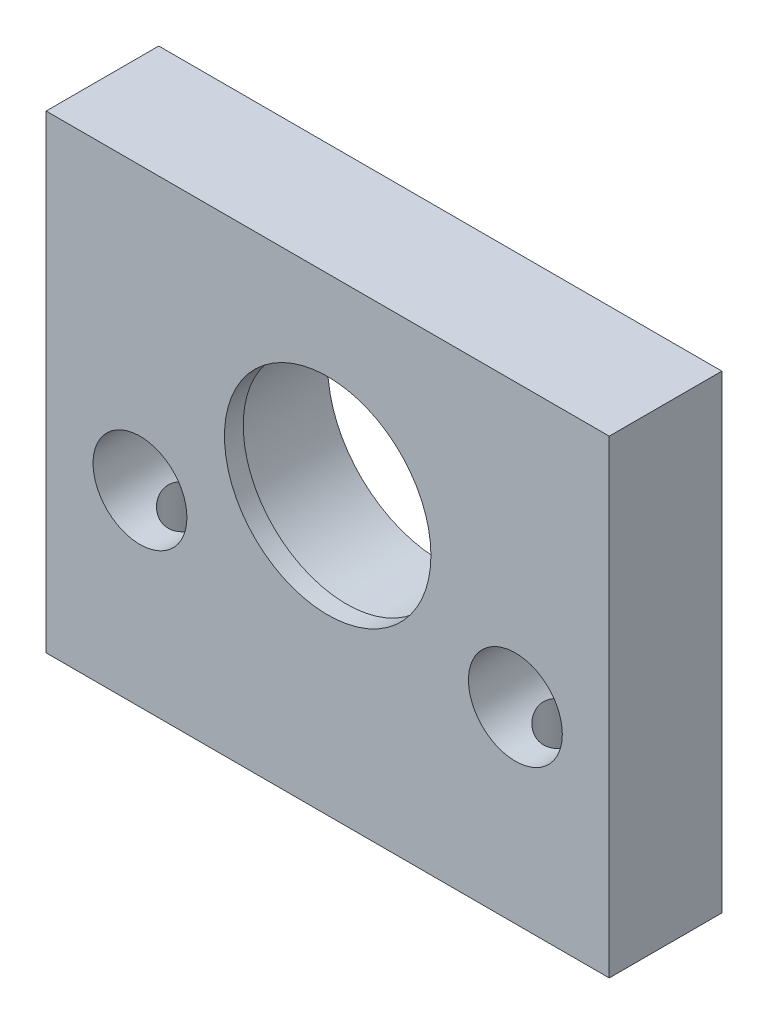
ISO-10303-21;
HEADER;
FILE_DESCRIPTION(('STEP AP214'),'2;1');
FILE_NAME('part.step','',(''),(''),'','','');
FILE_SCHEMA(('AUTOMOTIVE_DESIGN { 1 0 10303 214 1 1 1 1 }'));
ENDSEC;
DATA;
#1=APPLICATION_CONTEXT('core data for automotive mechanical design processes');
#2=APPLICATION_PROTOCOL_DEFINITION('international standard','automotive_design',2000,#1);
#3=PRODUCT_CONTEXT('',#1,'mechanical');
#4=PRODUCT('Part','Part','',(#3));
#5=PRODUCT_RELATED_PRODUCT_CATEGORY('part','',(#4));
#6=PRODUCT_DEFINITION_FORMATION('','',#4);
#7=PRODUCT_DEFINITION_CONTEXT('part definition',#1,'design');
#8=PRODUCT_DEFINITION('design','',#6,#7);
#9=PRODUCT_DEFINITION_SHAPE('','',#8);
#10=(LENGTH_UNIT() NAMED_UNIT(*) SI_UNIT(.MILLI.,.METRE.));
#11=(NAMED_UNIT(*) PLANE_ANGLE_UNIT() SI_UNIT($,.RADIAN.));
#12=(NAMED_UNIT(*) SI_UNIT($,.STERADIAN.) SOLID_ANGLE_UNIT());
#13=UNCERTAINTY_MEASURE_WITH_UNIT(LENGTH_MEASURE(1.E-05),#10,'distance_accuracy_value','');
#14=(GEOMETRIC_REPRESENTATION_CONTEXT(3) GLOBAL_UNCERTAINTY_ASSIGNED_CONTEXT((#13)) GLOBAL_UNIT_ASSIGNED_CONTEXT((#10,
#11,#12)) REPRESENTATION_CONTEXT('',''));
#15=CARTESIAN_POINT('',(0.,0.,0.));
#16=DIRECTION('',(0.,0.,1.));
#17=DIRECTION('',(1.,0.,0.));
#18=AXIS2_PLACEMENT_3D('',#15,#16,#17);
#19=CARTESIAN_POINT('',(30.,25.,12.));
#20=DIRECTION('',(-1.,0.,0.));
#21=DIRECTION('',(0.,-1.,0.));
#22=AXIS2_PLACEMENT_3D('',#19,#20,#21);
#23=PLANE('',#22);
#24=DIRECTION('',(0.,1.,0.));
#25=VECTOR('',#24,1.);
#26=CARTESIAN_POINT('',(30.,25.,0.));
#27=LINE('',#26,#25);
#28=CARTESIAN_POINT('',(30.,-25.,0.));
#29=VERTEX_POINT('',#28);
#30=CARTESIAN_POINT('',(30.,25.,0.));
#31=VERTEX_POINT('',#30);
#32=EDGE_CURVE('E96',#29,#31,#27,.T.);
#33=ORIENTED_EDGE('',*,*,#32,.T.);
#34=DIRECTION('',(0.,0.,-1.));
#35=VECTOR('',#34,1.);
#36=CARTESIAN_POINT('',(30.,25.,12.));
#37=LINE('',#36,#35);
#38=CARTESIAN_POINT('',(30.,25.,12.));
#39=VERTEX_POINT('',#38);
#40=EDGE_CURVE('E11',#39,#31,#37,.T.);
#41=ORIENTED_EDGE('',*,*,#40,.F.);
#42=DIRECTION('',(0.,1.,0.));
#43=VECTOR('',#42,1.);
#44=CARTESIAN_POINT('',(30.,25.,12.));
#45=LINE('',#44,#43);
#46=CARTESIAN_POINT('',(30.,-25.,12.));
#47=VERTEX_POINT('',#46);
#48=EDGE_CURVE('E84',#47,#39,#45,.T.);
#49=ORIENTED_EDGE('',*,*,#48,.F.);
#50=DIRECTION('',(0.,0.,-1.));
#51=VECTOR('',#50,1.);
#52=CARTESIAN_POINT('',(30.,-25.,12.));
#53=LINE('',#52,#51);
#54=EDGE_CURVE('E92',#47,#29,#53,.T.);
#55=ORIENTED_EDGE('',*,*,#54,.T.);
#56=EDGE_LOOP('',(#33,#41,#49,#55));
#57=FACE_BOUND('',#56,.T.);
#58=ADVANCED_FACE('F33',(#57),#23,.F.);
#59=CARTESIAN_POINT('',(-30.,25.,12.));
#60=DIRECTION('',(0.,-1.,0.));
#61=DIRECTION('',(0.,0.,-1.));
#62=AXIS2_PLACEMENT_3D('',#59,#60,#61);
#63=PLANE('',#62);
#64=DIRECTION('',(-1.,0.,0.));
#65=VECTOR('',#64,1.);
#66=CARTESIAN_POINT('',(-30.,25.,0.));
#67=LINE('',#66,#65);
#68=CARTESIAN_POINT('',(-30.,25.,0.));
#69=VERTEX_POINT('',#68);
#70=EDGE_CURVE('E88',#31,#69,#67,.T.);
#71=ORIENTED_EDGE('',*,*,#70,.T.);
#72=DIRECTION('',(0.,0.,-1.));
#73=VECTOR('',#72,1.);
#74=CARTESIAN_POINT('',(-30.,25.,12.));
#75=LINE('',#74,#73);
#76=CARTESIAN_POINT('',(-30.,25.,12.));
#77=VERTEX_POINT('',#76);
#78=EDGE_CURVE('E41',#77,#69,#75,.T.);
#79=ORIENTED_EDGE('',*,*,#78,.F.);
#80=DIRECTION('',(-1.,0.,0.));
#81=VECTOR('',#80,1.);
#82=CARTESIAN_POINT('',(-30.,25.,12.));
#83=LINE('',#82,#81);
#84=EDGE_CURVE('E79',#39,#77,#83,.T.);
#85=ORIENTED_EDGE('',*,*,#84,.F.);
#86=ORIENTED_EDGE('',*,*,#40,.T.);
#87=EDGE_LOOP('',(#71,#79,#85,#86));
#88=FACE_BOUND('',#87,.T.);
#89=ADVANCED_FACE('F87',(#88),#63,.F.);
#90=CARTESIAN_POINT('',(-30.,25.,12.));
#91=DIRECTION('',(1.,0.,0.));
#92=DIRECTION('',(0.,1.,0.));
#93=AXIS2_PLACEMENT_3D('',#90,#91,#92);
#94=PLANE('',#93);
#95=DIRECTION('',(0.,-1.,0.));
#96=VECTOR('',#95,1.);
#97=CARTESIAN_POINT('',(-30.,25.,0.));
#98=LINE('',#97,#96);
#99=CARTESIAN_POINT('',(-30.,-25.,0.));
#100=VERTEX_POINT('',#99);
#101=EDGE_CURVE('E66',#69,#100,#98,.T.);
#102=ORIENTED_EDGE('',*,*,#101,.T.);
#103=DIRECTION('',(0.,0.,-1.));
#104=VECTOR('',#103,1.);
#105=CARTESIAN_POINT('',(-30.,-25.,12.));
#106=LINE('',#105,#104);
#107=CARTESIAN_POINT('',(-30.,-25.,12.));
#108=VERTEX_POINT('',#107);
#109=EDGE_CURVE('E89',#108,#100,#106,.T.);
#110=ORIENTED_EDGE('',*,*,#109,.F.);
#111=DIRECTION('',(0.,-1.,0.));
#112=VECTOR('',#111,1.);
#113=CARTESIAN_POINT('',(-30.,25.,12.));
#114=LINE('',#113,#112);
#115=EDGE_CURVE('E82',#77,#108,#114,.T.);
#116=ORIENTED_EDGE('',*,*,#115,.F.);
#117=ORIENTED_EDGE('',*,*,#78,.T.);
#118=EDGE_LOOP('',(#102,#110,#116,#117));
#119=FACE_BOUND('',#118,.T.);
#120=ADVANCED_FACE('F90',(#119),#94,.F.);
#121=CARTESIAN_POINT('',(-30.,-25.,12.));
#122=DIRECTION('',(0.,1.,0.));
#123=DIRECTION('',(0.,0.,1.));
#124=AXIS2_PLACEMENT_3D('',#121,#122,#123);
#125=PLANE('',#124);
#126=CARTESIAN_POINT('',(-20.,-25.,6.));
#127=DIRECTION('',(0.,-1.,0.));
#128=DIRECTION('',(0.,0.,-1.));
#129=AXIS2_PLACEMENT_3D('',#126,#127,#128);
#130=CIRCLE('',#129,3.);
#131=CARTESIAN_POINT('',(-20.,-25.,2.99999999999999));
#132=VERTEX_POINT('',#131);
#133=EDGE_CURVE('E134',#132,#132,#130,.T.);
#134=ORIENTED_EDGE('',*,*,#133,.F.);
#135=EDGE_LOOP('',(#134));
#136=FACE_BOUND('',#135,.T.);
#137=CARTESIAN_POINT('',(20.,-25.,6.));
#138=DIRECTION('',(0.,-1.,0.));
#139=DIRECTION('',(0.,0.,-1.));
#140=AXIS2_PLACEMENT_3D('',#137,#138,#139);
#141=CIRCLE('',#140,2.99999999999999);
#142=CARTESIAN_POINT('',(20.,-25.,3.00000000000001));
#143=VERTEX_POINT('',#142);
#144=EDGE_CURVE('E124',#143,#143,#141,.T.);
#145=ORIENTED_EDGE('',*,*,#144,.F.);
#146=EDGE_LOOP('',(#145));
#147=FACE_BOUND('',#146,.T.);
#148=DIRECTION('',(1.,0.,0.));
#149=VECTOR('',#148,1.);
#150=CARTESIAN_POINT('',(-30.,-25.,0.));
#151=LINE('',#150,#149);
#152=EDGE_CURVE('E72',#100,#29,#151,.T.);
#153=ORIENTED_EDGE('',*,*,#152,.T.);
#154=ORIENTED_EDGE('',*,*,#54,.F.);
#155=DIRECTION('',(1.,0.,0.));
#156=VECTOR('',#155,1.);
#157=CARTESIAN_POINT('',(-30.,-25.,12.));
#158=LINE('',#157,#156);
#159=EDGE_CURVE('E49',#108,#47,#158,.T.);
#160=ORIENTED_EDGE('',*,*,#159,.F.);
#161=ORIENTED_EDGE('',*,*,#109,.T.);
#162=EDGE_LOOP('',(#153,#154,#160,#161));
#163=FACE_BOUND('',#162,.T.);
#164=ADVANCED_FACE('F104',(#136,#147,#163),#125,.F.);
#165=CARTESIAN_POINT('',(30.,-25.,12.));
#166=DIRECTION('',(0.,0.,1.));
#167=DIRECTION('',(1.,0.,0.));
#168=AXIS2_PLACEMENT_3D('',#165,#166,#167);
#169=PLANE('',#168);
#170=CARTESIAN_POINT('',(20.,-5.,12.));
#171=DIRECTION('',(0.,0.,1.));
#172=DIRECTION('',(1.,0.,0.));
#173=AXIS2_PLACEMENT_3D('',#170,#171,#172);
#174=CIRCLE('',#173,5.);
#175=CARTESIAN_POINT('',(25.,-5.,12.));
#176=VERTEX_POINT('',#175);
#177=EDGE_CURVE('E121',#176,#176,#174,.T.);
#178=ORIENTED_EDGE('',*,*,#177,.F.);
#179=EDGE_LOOP('',(#178));
#180=FACE_BOUND('',#179,.T.);
#181=CARTESIAN_POINT('',(-20.,-5.,12.));
#182=DIRECTION('',(0.,0.,1.));
#183=DIRECTION('',(1.,0.,0.));
#184=AXIS2_PLACEMENT_3D('',#181,#182,#183);
#185=CIRCLE('',#184,5.);
#186=CARTESIAN_POINT('',(-15.,-5.,12.));
#187=VERTEX_POINT('',#186);
#188=EDGE_CURVE('E115',#187,#187,#185,.T.);
#189=ORIENTED_EDGE('',*,*,#188,.F.);
#190=EDGE_LOOP('',(#189));
#191=FACE_BOUND('',#190,.T.);
#192=CARTESIAN_POINT('',(0.,4.5,12.));
#193=DIRECTION('',(0.,0.,1.));
#194=DIRECTION('',(1.,0.,0.));
#195=AXIS2_PLACEMENT_3D('',#192,#193,#194);
#196=CIRCLE('',#195,11.);
#197=CARTESIAN_POINT('',(11.,4.5,12.));
#198=VERTEX_POINT('',#197);
#199=EDGE_CURVE('E99',#198,#198,#196,.T.);
#200=ORIENTED_EDGE('',*,*,#199,.F.);
#201=EDGE_LOOP('',(#200));
#202=FACE_BOUND('',#201,.T.);
#203=ORIENTED_EDGE('',*,*,#48,.T.);
#204=ORIENTED_EDGE('',*,*,#84,.T.);
#205=ORIENTED_EDGE('',*,*,#115,.T.);
#206=ORIENTED_EDGE('',*,*,#159,.T.);
#207=EDGE_LOOP('',(#203,#204,#205,#206));
#208=FACE_BOUND('',#207,.T.);
#209=ADVANCED_FACE('F80',(#180,#191,#202,#208),#169,.T.);
#210=CARTESIAN_POINT('',(30.,-25.,0.));
#211=DIRECTION('',(0.,0.,1.));
#212=DIRECTION('',(1.,0.,0.));
#213=AXIS2_PLACEMENT_3D('',#210,#211,#212);
#214=PLANE('',#213);
#215=CARTESIAN_POINT('',(0.,4.5,0.));
#216=DIRECTION('',(0.,0.,1.));
#217=DIRECTION('',(1.,0.,0.));
#218=AXIS2_PLACEMENT_3D('',#215,#216,#217);
#219=CIRCLE('',#218,12.);
#220=CARTESIAN_POINT('',(12.,4.5,0.));
#221=VERTEX_POINT('',#220);
#222=EDGE_CURVE('E157',#221,#221,#219,.F.);
#223=ORIENTED_EDGE('',*,*,#222,.F.);
#224=EDGE_LOOP('',(#223));
#225=FACE_BOUND('',#224,.T.);
#226=CARTESIAN_POINT('',(20.,-5.,0.));
#227=DIRECTION('',(0.,0.,1.));
#228=DIRECTION('',(1.,0.,0.));
#229=AXIS2_PLACEMENT_3D('',#226,#227,#228);
#230=CIRCLE('',#229,5.);
#231=CARTESIAN_POINT('',(25.,-5.,0.));
#232=VERTEX_POINT('',#231);
#233=EDGE_CURVE('E118',#232,#232,#230,.F.);
#234=ORIENTED_EDGE('',*,*,#233,.F.);
#235=EDGE_LOOP('',(#234));
#236=FACE_BOUND('',#235,.T.);
#237=CARTESIAN_POINT('',(-20.,-5.,0.));
#238=DIRECTION('',(0.,0.,1.));
#239=DIRECTION('',(1.,0.,0.));
#240=AXIS2_PLACEMENT_3D('',#237,#238,#239);
#241=CIRCLE('',#240,5.);
#242=CARTESIAN_POINT('',(-15.,-5.,0.));
#243=VERTEX_POINT('',#242);
#244=EDGE_CURVE('E112',#243,#243,#241,.F.);
#245=ORIENTED_EDGE('',*,*,#244,.F.);
#246=EDGE_LOOP('',(#245));
#247=FACE_BOUND('',#246,.T.);
#248=ORIENTED_EDGE('',*,*,#32,.F.);
#249=ORIENTED_EDGE('',*,*,#152,.F.);
#250=ORIENTED_EDGE('',*,*,#101,.F.);
#251=ORIENTED_EDGE('',*,*,#70,.F.);
#252=EDGE_LOOP('',(#248,#249,#250,#251));
#253=FACE_BOUND('',#252,.T.);
#254=ADVANCED_FACE('F107',(#225,#236,#247,#253),#214,.F.);
#255=CARTESIAN_POINT('',(0.,4.5,10.));
#256=DIRECTION('',(0.,0.,1.));
#257=DIRECTION('',(1.,0.,0.));
#258=AXIS2_PLACEMENT_3D('',#255,#256,#257);
#259=CYLINDRICAL_SURFACE('',#258,11.);
#260=CARTESIAN_POINT('',(0.,4.5,10.));
#261=DIRECTION('',(0.,0.,1.));
#262=DIRECTION('',(1.,0.,0.));
#263=AXIS2_PLACEMENT_3D('',#260,#261,#262);
#264=CIRCLE('',#263,11.);
#265=CARTESIAN_POINT('',(11.,4.5,10.));
#266=VERTEX_POINT('',#265);
#267=EDGE_CURVE('E154',#266,#266,#264,.F.);
#268=ORIENTED_EDGE('',*,*,#267,.T.);
#269=EDGE_LOOP('',(#268));
#270=FACE_BOUND('',#269,.T.);
#271=ORIENTED_EDGE('',*,*,#199,.T.);
#272=EDGE_LOOP('',(#271));
#273=FACE_BOUND('',#272,.T.);
#274=ADVANCED_FACE('F172',(#270,#273),#259,.F.);
#275=CARTESIAN_POINT('',(-20.,-5.,-0.000999999999999265));
#276=DIRECTION('',(0.,0.,1.));
#277=DIRECTION('',(1.,0.,0.));
#278=AXIS2_PLACEMENT_3D('',#275,#276,#277);
#279=CYLINDRICAL_SURFACE('',#278,5.);
#280=CARTESIAN_POINT('',(-20.,-10.,2.99999999999999));
#281=CARTESIAN_POINT('',(-20.0767697294352,-9.99999907546385,3.00000105624453));
#282=CARTESIAN_POINT('',(-20.1535621345184,-9.99822567812271,3.00295359357007));
#283=CARTESIAN_POINT('',(-20.3065484877587,-9.99118362570631,3.01471423297973));
#284=CARTESIAN_POINT('',(-20.3827420593466,-9.98591292553957,3.02352576118822));
#285=CARTESIAN_POINT('',(-20.6098081300246,-9.96499345352549,3.05864855946312));
#286=CARTESIAN_POINT('',(-20.7589818632917,-9.94423772571335,3.09364770243343));
#287=CARTESIAN_POINT('',(-21.0475416736358,-9.89123238995897,3.18477274350412));
#288=CARTESIAN_POINT('',(-21.1869722674134,-9.85903979551111,3.24079392201273));
#289=CARTESIAN_POINT('',(-21.4540504280022,-9.7859070225578,3.37172066059704));
#290=CARTESIAN_POINT('',(-21.5817009093826,-9.74496901614699,3.44662153236015));
#291=CARTESIAN_POINT('',(-21.8326016038182,-9.65410731283371,3.61954965511511));
#292=CARTESIAN_POINT('',(-21.9547688598616,-9.60373587041895,3.71890739116653));
#293=CARTESIAN_POINT('',(-22.1817645874806,-9.50060875905921,3.93493440719218));
#294=CARTESIAN_POINT('',(-22.286570467504,-9.4478500955754,4.05162587421834));
#295=CARTESIAN_POINT('',(-22.4889001950984,-9.33822134833336,4.3158470211689));
#296=CARTESIAN_POINT('',(-22.5839553962784,-9.28164035635798,4.46540354212217));
#297=CARTESIAN_POINT('',(-22.7472286867078,-9.17876602596122,4.78169314632688));
#298=CARTESIAN_POINT('',(-22.8154903315581,-9.13245604474887,4.94839779203315));
#299=CARTESIAN_POINT('',(-22.9088120457722,-9.06709259377224,5.25319290165689));
#300=CARTESIAN_POINT('',(-22.9403239458764,-9.04415766338646,5.38847199836138));
#301=CARTESIAN_POINT('',(-22.9843234458708,-9.01180616527622,5.66360743052139));
#302=CARTESIAN_POINT('',(-22.9968346988436,-9.00237279089369,5.80345785330403));
#303=CARTESIAN_POINT('',(-23.0021101681982,-8.99841845126252,6.08402299264786));
#304=CARTESIAN_POINT('',(-22.9948356363078,-9.0039267475674,6.22473886591187));
#305=CARTESIAN_POINT('',(-22.960921241461,-9.02906522155629,6.50255753511785));
#306=CARTESIAN_POINT('',(-22.9342668122544,-9.04870602134774,6.63965753294148));
#307=CARTESIAN_POINT('',(-22.8634783193319,-9.09906376582929,6.90506054225053));
#308=CARTESIAN_POINT('',(-22.8195745342289,-9.12963433300038,7.03345432299445));
#309=CARTESIAN_POINT('',(-22.7159016746707,-9.19854092703027,7.2813897666318));
#310=CARTESIAN_POINT('',(-22.6561267841416,-9.2368797994146,7.40092816382902));
#311=CARTESIAN_POINT('',(-22.5103577382067,-9.32510698365562,7.64996913765634));
#312=CARTESIAN_POINT('',(-22.4216067190187,-9.3758426358075,7.77755999236773));
#313=CARTESIAN_POINT('',(-22.2258296320778,-9.47861022524151,8.01734915722011));
#314=CARTESIAN_POINT('',(-22.118786093355,-9.53064336077654,8.12953256540213));
#315=CARTESIAN_POINT('',(-21.8715904092136,-9.63871766962914,8.35124225944849));
#316=CARTESIAN_POINT('',(-21.7289031517877,-9.69430681953073,8.45821939123735));
#317=CARTESIAN_POINT('',(-21.5006105363028,-9.77018325995048,8.59926871272286));
#318=CARTESIAN_POINT('',(-21.4220982181568,-9.79423315237468,8.6430641355161));
#319=CARTESIAN_POINT('',(-21.2607436867391,-9.8391649675643,8.723718823611));
#320=CARTESIAN_POINT('',(-21.1779041750117,-9.86004883588963,8.7605823520208));
#321=CARTESIAN_POINT('',(-21.01376371174,-9.89682672744931,8.82481144285663));
#322=CARTESIAN_POINT('',(-20.9326900666639,-9.91295100454954,8.85262656044921));
#323=CARTESIAN_POINT('',(-20.7678799497328,-9.94139126794745,8.90133395584523));
#324=CARTESIAN_POINT('',(-20.6841449971746,-9.95370938553284,8.92223010844636));
#325=CARTESIAN_POINT('',(-20.5147444626544,-9.97416370514887,8.95677185472475));
#326=CARTESIAN_POINT('',(-20.4290803419696,-9.98230296820872,8.97042275582861));
#327=CARTESIAN_POINT('',(-20.2566217465922,-9.99415996414414,8.9902661843902));
#328=CARTESIAN_POINT('',(-20.1698274326177,-9.99787831889699,8.99645976085132));
#329=CARTESIAN_POINT('',(-19.9326757428893,-10.001791579548,9.00299267028362));
#330=CARTESIAN_POINT('',(-19.7819431573893,-9.99746512571837,8.9958115456306));
#331=CARTESIAN_POINT('',(-19.484313092371,-9.97557955020067,8.9591544582709));
#332=CARTESIAN_POINT('',(-19.337415535147,-9.95802069684413,8.92967894765814));
#333=CARTESIAN_POINT('',(-19.0548574007452,-9.91189447655688,8.85091154081572));
#334=CARTESIAN_POINT('',(-18.9190104514305,-9.88360514429733,8.80211887340799));
#335=CARTESIAN_POINT('',(-18.6574665481525,-9.81827798628348,8.68664567579909));
#336=CARTESIAN_POINT('',(-18.5317716025372,-9.78123843515362,8.61996161740592));
#337=CARTESIAN_POINT('',(-18.2799880786985,-9.69690981059277,8.46288590902202));
#338=CARTESIAN_POINT('',(-18.1552118617578,-9.6489560240695,8.37075230616252));
#339=CARTESIAN_POINT('',(-17.9219477745178,-9.54948534225871,8.16921724874524));
#340=CARTESIAN_POINT('',(-17.8134791484584,-9.49796434043363,8.05979570039729));
#341=CARTESIAN_POINT('',(-17.6013601173584,-9.38890846835682,7.81017920850684));
#342=CARTESIAN_POINT('',(-17.5001796211583,-9.33146483230154,7.66783222605696));
#343=CARTESIAN_POINT('',(-17.3230952079246,-9.2243236439557,7.36556795387244));
#344=CARTESIAN_POINT('',(-17.2471646615454,-9.17461796061409,7.20566941284874));
#345=CARTESIAN_POINT('',(-17.1371484264829,-9.09969818429266,6.90751395488927));
#346=CARTESIAN_POINT('',(-17.0975674933739,-9.07151318633887,6.77203937535795));
#347=CARTESIAN_POINT('',(-17.037726721783,-9.02819211510624,6.49493584376476));
#348=CARTESIAN_POINT('',(-17.0174400960493,-9.01303795327895,6.35331571054848));
#349=CARTESIAN_POINT('',(-16.9973173896579,-8.99800893189922,6.06724610560478));
#350=CARTESIAN_POINT('',(-16.9975582096915,-8.99819152744816,5.92278802175169));
#351=CARTESIAN_POINT('',(-17.0186705489689,-9.01395435932838,5.6362111256536));
#352=CARTESIAN_POINT('',(-17.0395532863041,-9.02954296823692,5.49409362812519));
#353=CARTESIAN_POINT('',(-17.0991964878777,-9.07266369966216,5.2230231760049));
#354=CARTESIAN_POINT('',(-17.1370471567135,-9.09958421715569,5.09376585207564));
#355=CARTESIAN_POINT('',(-17.2287352648797,-9.16211005816609,4.84332545034685));
#356=CARTESIAN_POINT('',(-17.2825787248228,-9.19771865147484,4.722145434387));
#357=CARTESIAN_POINT('',(-17.414214631403,-9.28025972950371,4.47136046054001));
#358=CARTESIAN_POINT('',(-17.4944148176844,-9.32809142579694,4.34331849178523));
#359=CARTESIAN_POINT('',(-17.6724878625304,-9.42640286674054,4.1012391546934));
#360=CARTESIAN_POINT('',(-17.7703752738793,-9.47688476749087,3.98721344952045));
#361=CARTESIAN_POINT('',(-17.9997964644744,-9.5845123827036,3.75730115667053));
#362=CARTESIAN_POINT('',(-18.1342142820948,-9.64140045738634,3.64415012013839));
#363=CARTESIAN_POINT('',(-18.4231072218656,-9.74731429537958,3.44179201395186));
#364=CARTESIAN_POINT('',(-18.5775895042632,-9.79633723789531,3.35259352708028));
#365=CARTESIAN_POINT('',(-18.8189781033831,-9.85920558314903,3.24087552580947));
#366=CARTESIAN_POINT('',(-18.8997498571486,-9.87817139185349,3.2076640040355));
#367=CARTESIAN_POINT('',(-19.0645577820116,-9.91243413775203,3.14822786185654));
#368=CARTESIAN_POINT('',(-19.1485920152119,-9.9277332153652,3.12199916429906));
#369=CARTESIAN_POINT('',(-19.3189981839254,-9.95415527987996,3.07699055792425));
#370=CARTESIAN_POINT('',(-19.4053624993907,-9.9652904423195,3.05818892269669));
#371=CARTESIAN_POINT('',(-19.5798162539792,-9.98308318645254,3.028255644677));
#372=CARTESIAN_POINT('',(-19.6679041932156,-9.98974449723791,3.01711761384668));
#373=CARTESIAN_POINT('',(-19.7968760703387,-9.99603728421478,3.00660831619467));
#374=CARTESIAN_POINT('',(-19.8374437188865,-9.99752198179196,3.004131569546));
#375=CARTESIAN_POINT('',(-19.9186721218132,-9.99950360169341,3.00082710308606));
#376=CARTESIAN_POINT('',(-19.9593328793728,-10.0000004897532,2.99999944047706));
#377=CARTESIAN_POINT('',(-20.,-10.,2.99999999999999));
#378=B_SPLINE_CURVE_WITH_KNOTS('',3,(#280,#281,#282,#283,#284,#285,#286,#287,#288,#289,#290,
#291,#292,#293,#294,#295,#296,#297,#298,#299,#300,#301,#302,#303,#304,#305,#306,#307,#308,#309,
#310,#311,#312,#313,#314,#315,#316,#317,#318,#319,#320,#321,#322,#323,#324,#325,#326,#327,#328,
#329,#330,#331,#332,#333,#334,#335,#336,#337,#338,#339,#340,#341,#342,#343,#344,#345,#346,#347,
#348,#349,#350,#351,#352,#353,#354,#355,#356,#357,#358,#359,#360,#361,#362,#363,#364,#365,#366,
#367,#368,#369,#370,#371,#372,#373,#374,#375,#376,#377),.UNSPECIFIED.,.T.,.F.,(4,2,2,2,2,2,2,2,
2,2,2,2,2,2,2,2,2,2,2,2,2,2,2,2,2,2,2,2,2,2,2,2,2,2,2,2,2,2,2,2,2,2,2,2,2,2,2,2,4),(0.,
0.230263300595001,0.460661369333398,0.922002149276123,1.38107466343612,1.84003329022065,
2.33408870888555,2.82878205293211,3.38413315803224,3.93857770807793,4.35913349134877,
4.77916531256766,5.20002031165062,5.62119195971355,6.03692224610024,6.45280509043347,
6.94139679873936,7.43045779030959,7.98767605192993,8.26653157143432,8.54521503013734,
8.80648473589063,9.06760787545943,9.3285394673096,9.58943435026958,10.0398406663534,
10.490237849174,10.9296843257003,11.3692175250854,11.8543559282721,12.3400624135416,
12.889063860465,13.437484464234,13.8674843581987,14.2968863865712,14.7278971274535,
15.1591422350194,15.5696105785277,15.9802336423656,16.4539008129506,16.927959499309,
17.4794148474152,18.0310675325446,18.2988384573895,18.5664526907294,18.8332781687618,
19.0998809626714,19.221853785686,19.3438308395353),.UNSPECIFIED.);
#379=CARTESIAN_POINT('',(-20.,-10.,2.99999999999999));
#380=VERTEX_POINT('',#379);
#381=EDGE_CURVE('E149',#380,#380,#378,.T.);
#382=ORIENTED_EDGE('',*,*,#381,.F.);
#383=EDGE_LOOP('',(#382));
#384=FACE_BOUND('',#383,.T.);
#385=ORIENTED_EDGE('',*,*,#188,.T.);
#386=EDGE_LOOP('',(#385));
#387=FACE_BOUND('',#386,.T.);
#388=ORIENTED_EDGE('',*,*,#244,.T.);
#389=EDGE_LOOP('',(#388));
#390=FACE_BOUND('',#389,.T.);
#391=ADVANCED_FACE('F175',(#384,#387,#390),#279,.F.);
#392=CARTESIAN_POINT('',(20.,-5.,-0.000999999999999265));
#393=DIRECTION('',(0.,0.,1.));
#394=DIRECTION('',(1.,0.,0.));
#395=AXIS2_PLACEMENT_3D('',#392,#393,#394);
#396=CYLINDRICAL_SURFACE('',#395,5.);
#397=CARTESIAN_POINT('',(20.,-10.,3.00000000000001));
#398=CARTESIAN_POINT('',(19.9232302705648,-9.99999907546385,3.00000105624454));
#399=CARTESIAN_POINT('',(19.8464378654816,-9.99822567812271,3.00295359357008));
#400=CARTESIAN_POINT('',(19.6934515122413,-9.99118362570631,3.01471423297974));
#401=CARTESIAN_POINT('',(19.6172579406534,-9.98591292553957,3.02352576118824));
#402=CARTESIAN_POINT('',(19.3901918699754,-9.96499345352549,3.05864855946313));
#403=CARTESIAN_POINT('',(19.2410181367083,-9.94423772571335,3.09364770243345));
#404=CARTESIAN_POINT('',(18.9524583263642,-9.89123238995897,3.18477274350413));
#405=CARTESIAN_POINT('',(18.8130277325866,-9.85903979551111,3.24079392201274));
#406=CARTESIAN_POINT('',(18.5459495719978,-9.7859070225578,3.37172066059705));
#407=CARTESIAN_POINT('',(18.4182990906174,-9.74496901614699,3.44662153236017));
#408=CARTESIAN_POINT('',(18.1673983961818,-9.65410731283371,3.61954965511512));
#409=CARTESIAN_POINT('',(18.0452311401383,-9.60373587041895,3.71890739116655));
#410=CARTESIAN_POINT('',(17.8182354125194,-9.50060875905921,3.93493440719219));
#411=CARTESIAN_POINT('',(17.713429532496,-9.4478500955754,4.05162587421836));
#412=CARTESIAN_POINT('',(17.5110998049016,-9.33822134833336,4.31584702116892));
#413=CARTESIAN_POINT('',(17.4160446037216,-9.28164035635797,4.46540354212219));
#414=CARTESIAN_POINT('',(17.2527713132922,-9.17876602596122,4.78169314632689));
#415=CARTESIAN_POINT('',(17.1845096684419,-9.13245604474887,4.94839779203316));
#416=CARTESIAN_POINT('',(17.0911879542278,-9.06709259377224,5.2531929016569));
#417=CARTESIAN_POINT('',(17.0596760541236,-9.04415766338646,5.38847199836139));
#418=CARTESIAN_POINT('',(17.0156765541292,-9.01180616527622,5.6636074305214));
#419=CARTESIAN_POINT('',(17.0031653011564,-9.00237279089368,5.80345785330404));
#420=CARTESIAN_POINT('',(16.9978898318018,-8.99841845126252,6.08402299264786));
#421=CARTESIAN_POINT('',(17.0051643636922,-9.0039267475674,6.22473886591187));
#422=CARTESIAN_POINT('',(17.039078758539,-9.02906522155629,6.50255753511786));
#423=CARTESIAN_POINT('',(17.0657331877456,-9.04870602134774,6.63965753294149));
#424=CARTESIAN_POINT('',(17.1365216806681,-9.09906376582929,6.90506054225054));
#425=CARTESIAN_POINT('',(17.1804254657711,-9.12963433300038,7.03345432299445));
#426=CARTESIAN_POINT('',(17.2840983253293,-9.19854092703027,7.2813897666318));
#427=CARTESIAN_POINT('',(17.3438732158584,-9.2368797994146,7.40092816382902));
#428=CARTESIAN_POINT('',(17.4896422617933,-9.32510698365562,7.64996913765634));
#429=CARTESIAN_POINT('',(17.5783932809813,-9.3758426358075,7.77755999236773));
#430=CARTESIAN_POINT('',(17.7741703679222,-9.47861022524151,8.01734915722012));
#431=CARTESIAN_POINT('',(17.881213906645,-9.53064336077654,8.12953256540213));
#432=CARTESIAN_POINT('',(18.1284095907864,-9.63871766962914,8.35124225944849));
#433=CARTESIAN_POINT('',(18.2710968482123,-9.69430681953073,8.45821939123735));
#434=CARTESIAN_POINT('',(18.4993894636972,-9.77018325995048,8.59926871272286));
#435=CARTESIAN_POINT('',(18.5779017818432,-9.79423315237468,8.6430641355161));
#436=CARTESIAN_POINT('',(18.7392563132609,-9.8391649675643,8.72371882361099));
#437=CARTESIAN_POINT('',(18.8220958249883,-9.86004883588963,8.7605823520208));
#438=CARTESIAN_POINT('',(18.98623628826,-9.89682672744931,8.82481144285663));
#439=CARTESIAN_POINT('',(19.0673099333361,-9.91295100454954,8.8526265604492));
#440=CARTESIAN_POINT('',(19.2321200502672,-9.94139126794745,8.90133395584523));
#441=CARTESIAN_POINT('',(19.3158550028254,-9.95370938553284,8.92223010844636));
#442=CARTESIAN_POINT('',(19.4852555373456,-9.97416370514887,8.95677185472475));
#443=CARTESIAN_POINT('',(19.5709196580304,-9.98230296820872,8.9704227558286));
#444=CARTESIAN_POINT('',(19.7433782534078,-9.99415996414414,8.9902661843902));
#445=CARTESIAN_POINT('',(19.8301725673822,-9.99787831889699,8.99645976085132));
#446=CARTESIAN_POINT('',(20.0673242571106,-10.001791579548,9.00299267028362));
#447=CARTESIAN_POINT('',(20.2180568426107,-9.99746512571837,8.99581154563059));
#448=CARTESIAN_POINT('',(20.515686907629,-9.97557955020067,8.95915445827089));
#449=CARTESIAN_POINT('',(20.662584464853,-9.95802069684413,8.92967894765813));
#450=CARTESIAN_POINT('',(20.9451425992548,-9.91189447655688,8.85091154081572));
#451=CARTESIAN_POINT('',(21.0809895485694,-9.88360514429733,8.80211887340799));
#452=CARTESIAN_POINT('',(21.3425334518475,-9.81827798628348,8.68664567579909));
#453=CARTESIAN_POINT('',(21.4682283974628,-9.78123843515363,8.61996161740592));
#454=CARTESIAN_POINT('',(21.7200119213015,-9.69690981059278,8.46288590902202));
#455=CARTESIAN_POINT('',(21.8447881382422,-9.6489560240695,8.37075230616251));
#456=CARTESIAN_POINT('',(22.0780522254822,-9.54948534225871,8.16921724874523));
#457=CARTESIAN_POINT('',(22.1865208515416,-9.49796434043363,8.05979570039729));
#458=CARTESIAN_POINT('',(22.3986398826416,-9.38890846835682,7.81017920850684));
#459=CARTESIAN_POINT('',(22.4998203788417,-9.33146483230154,7.66783222605696));
#460=CARTESIAN_POINT('',(22.6769047920754,-9.22432364395571,7.36556795387244));
#461=CARTESIAN_POINT('',(22.7528353384546,-9.1746179606141,7.20566941284874));
#462=CARTESIAN_POINT('',(22.8628515735171,-9.09969818429267,6.90751395488927));
#463=CARTESIAN_POINT('',(22.9024325066261,-9.07151318633888,6.77203937535795));
#464=CARTESIAN_POINT('',(22.962273278217,-9.02819211510625,6.49493584376476));
#465=CARTESIAN_POINT('',(22.9825599039507,-9.01303795327896,6.35331571054848));
#466=CARTESIAN_POINT('',(23.0026826103421,-8.99800893189923,6.06724610560478));
#467=CARTESIAN_POINT('',(23.0024417903084,-8.99819152744817,5.92278802175169));
#468=CARTESIAN_POINT('',(22.981329451031,-9.01395435932839,5.6362111256536));
#469=CARTESIAN_POINT('',(22.9604467136959,-9.02954296823693,5.49409362812519));
#470=CARTESIAN_POINT('',(22.9008035121223,-9.07266369966217,5.2230231760049));
#471=CARTESIAN_POINT('',(22.8629528432865,-9.0995842171557,5.09376585207564));
#472=CARTESIAN_POINT('',(22.7712647351203,-9.1621100581661,4.84332545034685));
#473=CARTESIAN_POINT('',(22.7174212751772,-9.19771865147485,4.722145434387));
#474=CARTESIAN_POINT('',(22.585785368597,-9.28025972950372,4.47136046054001));
#475=CARTESIAN_POINT('',(22.5055851823156,-9.32809142579695,4.34331849178523));
#476=CARTESIAN_POINT('',(22.3275121374696,-9.42640286674055,4.1012391546934));
#477=CARTESIAN_POINT('',(22.2296247261207,-9.47688476749088,3.98721344952045));
#478=CARTESIAN_POINT('',(22.0002035355256,-9.58451238270361,3.75730115667053));
#479=CARTESIAN_POINT('',(21.8657857179051,-9.64140045738634,3.64415012013839));
#480=CARTESIAN_POINT('',(21.5768927781344,-9.74731429537958,3.44179201395186));
#481=CARTESIAN_POINT('',(21.4224104957368,-9.79633723789532,3.35259352708029));
#482=CARTESIAN_POINT('',(21.1810218966168,-9.85920558314903,3.24087552580948));
#483=CARTESIAN_POINT('',(21.1002501428513,-9.8781713918535,3.20766400403551));
#484=CARTESIAN_POINT('',(20.9354422179884,-9.91243413775203,3.14822786185654));
#485=CARTESIAN_POINT('',(20.8514079847881,-9.9277332153652,3.12199916429907));
#486=CARTESIAN_POINT('',(20.6810018160746,-9.95415527987996,3.07699055792426));
#487=CARTESIAN_POINT('',(20.5946375006093,-9.9652904423195,3.0581889226967));
#488=CARTESIAN_POINT('',(20.4201837460208,-9.98308318645254,3.02825564467702));
#489=CARTESIAN_POINT('',(20.3320958067844,-9.98974449723791,3.0171176138467));
#490=CARTESIAN_POINT('',(20.2031239296613,-9.99603728421478,3.00660831619468));
#491=CARTESIAN_POINT('',(20.1625562811135,-9.99752198179196,3.00413156954601));
#492=CARTESIAN_POINT('',(20.0813278781868,-9.99950360169341,3.00082710308607));
#493=CARTESIAN_POINT('',(20.0406671206272,-10.0000004897532,2.99999944047708));
#494=CARTESIAN_POINT('',(20.,-10.,3.00000000000001));
#495=B_SPLINE_CURVE_WITH_KNOTS('',3,(#397,#398,#399,#400,#401,#402,#403,#404,#405,#406,#407,
#408,#409,#410,#411,#412,#413,#414,#415,#416,#417,#418,#419,#420,#421,#422,#423,#424,#425,#426,
#427,#428,#429,#430,#431,#432,#433,#434,#435,#436,#437,#438,#439,#440,#441,#442,#443,#444,#445,
#446,#447,#448,#449,#450,#451,#452,#453,#454,#455,#456,#457,#458,#459,#460,#461,#462,#463,#464,
#465,#466,#467,#468,#469,#470,#471,#472,#473,#474,#475,#476,#477,#478,#479,#480,#481,#482,#483,
#484,#485,#486,#487,#488,#489,#490,#491,#492,#493,#494),.UNSPECIFIED.,.T.,.F.,(4,2,2,2,2,2,2,2,
2,2,2,2,2,2,2,2,2,2,2,2,2,2,2,2,2,2,2,2,2,2,2,2,2,2,2,2,2,2,2,2,2,2,2,2,2,2,2,2,4),(0.,
0.230263300595008,0.460661369333402,0.922002149276124,1.38107466343612,1.84003329022065,
2.33408870888555,2.82878205293211,3.38413315803224,3.93857770807793,4.35913349134876,
4.77916531256765,5.20002031165061,5.62119195971353,6.03692224610022,6.45280509043346,
6.94139679873934,7.43045779030957,7.98767605192991,8.2665315714343,8.54521503013732,
8.80648473589061,9.06760787545941,9.32853946730959,9.58943435026956,10.0398406663534,
10.4902378491739,10.9296843257003,11.3692175250853,11.8543559282721,12.3400624135416,
12.889063860465,13.437484464234,13.8674843581987,14.2968863865712,14.7278971274535,
15.1591422350193,15.5696105785277,15.9802336423655,16.4539008129505,16.927959499309,
17.4794148474152,18.0310675325445,18.2988384573894,18.5664526907294,18.8332781687617,
19.0998809626714,19.2218537856859,19.3438308395352),.UNSPECIFIED.);
#496=CARTESIAN_POINT('',(20.,-10.,3.00000000000001));
#497=VERTEX_POINT('',#496);
#498=EDGE_CURVE('E127',#497,#497,#495,.T.);
#499=ORIENTED_EDGE('',*,*,#498,.F.);
#500=EDGE_LOOP('',(#499));
#501=FACE_BOUND('',#500,.T.);
#502=ORIENTED_EDGE('',*,*,#177,.T.);
#503=EDGE_LOOP('',(#502));
#504=FACE_BOUND('',#503,.T.);
#505=ORIENTED_EDGE('',*,*,#233,.T.);
#506=EDGE_LOOP('',(#505));
#507=FACE_BOUND('',#506,.T.);
#508=ADVANCED_FACE('F218',(#501,#504,#507),#396,.F.);
#509=CARTESIAN_POINT('',(20.,25.001,6.));
#510=DIRECTION('',(0.,-1.,0.));
#511=DIRECTION('',(0.,0.,-1.));
#512=AXIS2_PLACEMENT_3D('',#509,#510,#511);
#513=CYLINDRICAL_SURFACE('',#512,2.99999999999999);
#514=ORIENTED_EDGE('',*,*,#144,.T.);
#515=EDGE_LOOP('',(#514));
#516=FACE_BOUND('',#515,.T.);
#517=ORIENTED_EDGE('',*,*,#498,.T.);
#518=EDGE_LOOP('',(#517));
#519=FACE_BOUND('',#518,.T.);
#520=ADVANCED_FACE('F136',(#516,#519),#513,.F.);
#521=CARTESIAN_POINT('',(-20.,25.001,6.));
#522=DIRECTION('',(0.,-1.,0.));
#523=DIRECTION('',(0.,0.,-1.));
#524=AXIS2_PLACEMENT_3D('',#521,#522,#523);
#525=CYLINDRICAL_SURFACE('',#524,3.);
#526=ORIENTED_EDGE('',*,*,#133,.T.);
#527=EDGE_LOOP('',(#526));
#528=FACE_BOUND('',#527,.T.);
#529=ORIENTED_EDGE('',*,*,#381,.T.);
#530=EDGE_LOOP('',(#529));
#531=FACE_BOUND('',#530,.T.);
#532=ADVANCED_FACE('F141',(#528,#531),#525,.F.);
#533=CARTESIAN_POINT('',(0.,4.5,10.));
#534=DIRECTION('',(0.,0.,1.));
#535=DIRECTION('',(1.,0.,0.));
#536=AXIS2_PLACEMENT_3D('',#533,#534,#535);
#537=PLANE('',#536);
#538=CARTESIAN_POINT('',(0.,4.5,10.));
#539=DIRECTION('',(0.,0.,1.));
#540=DIRECTION('',(1.,0.,0.));
#541=AXIS2_PLACEMENT_3D('',#538,#539,#540);
#542=CIRCLE('',#541,12.);
#543=CARTESIAN_POINT('',(12.,4.5,10.));
#544=VERTEX_POINT('',#543);
#545=EDGE_CURVE('E160',#544,#544,#542,.T.);
#546=ORIENTED_EDGE('',*,*,#545,.F.);
#547=EDGE_LOOP('',(#546));
#548=FACE_BOUND('',#547,.T.);
#549=ORIENTED_EDGE('',*,*,#267,.F.);
#550=EDGE_LOOP('',(#549));
#551=FACE_BOUND('',#550,.T.);
#552=ADVANCED_FACE('F145',(#548,#551),#537,.F.);
#553=CARTESIAN_POINT('',(0.,4.5,-0.000999999999999265));
#554=DIRECTION('',(0.,0.,1.));
#555=DIRECTION('',(1.,0.,0.));
#556=AXIS2_PLACEMENT_3D('',#553,#554,#555);
#557=CYLINDRICAL_SURFACE('',#556,12.);
#558=ORIENTED_EDGE('',*,*,#545,.T.);
#559=EDGE_LOOP('',(#558));
#560=FACE_BOUND('',#559,.T.);
#561=ORIENTED_EDGE('',*,*,#222,.T.);
#562=EDGE_LOOP('',(#561));
#563=FACE_BOUND('',#562,.T.);
#564=ADVANCED_FACE('F164',(#560,#563),#557,.F.);
#565=CLOSED_SHELL('',(#58,#89,#120,#164,#209,#254,#274,#391,#508,#520,#532,#552,#564));
#566=MANIFOLD_SOLID_BREP('B2',#565);
#567=ADVANCED_BREP_SHAPE_REPRESENTATION('',(#18,#566),#14);
#568=SHAPE_DEFINITION_REPRESENTATION(#9,#567);
ENDSEC;
END-ISO-10303-21;
